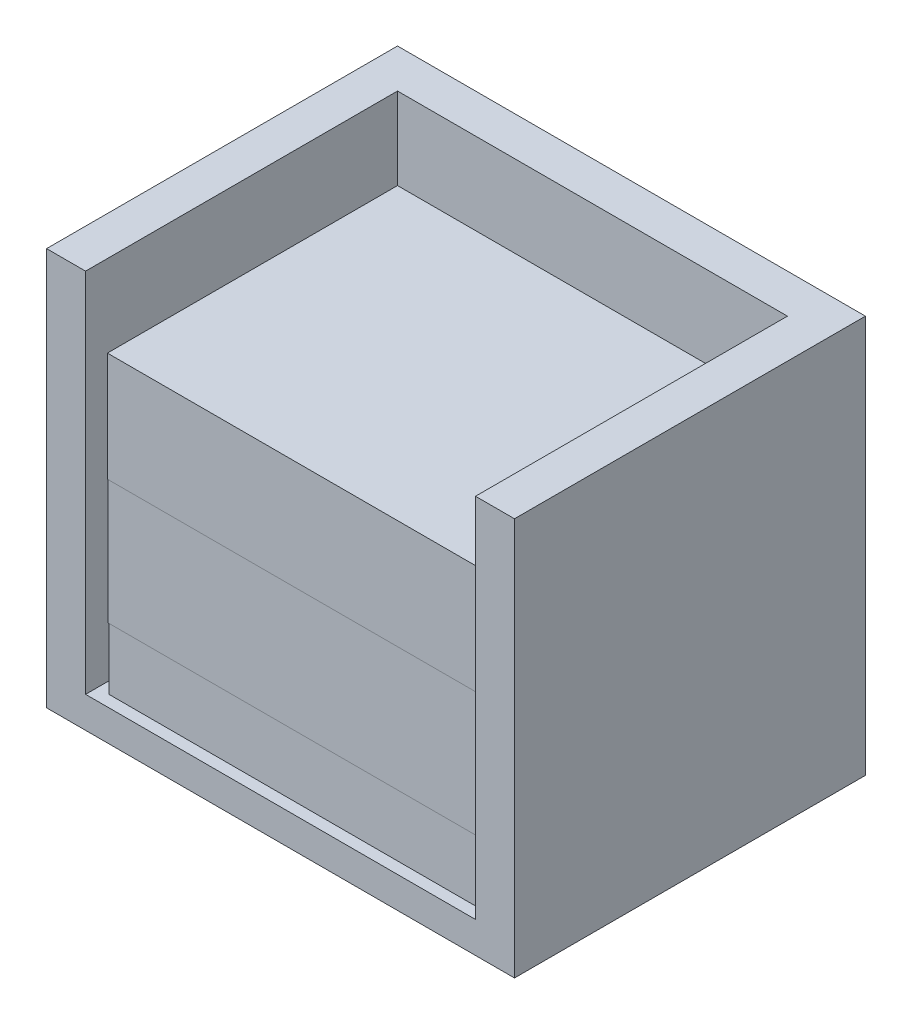
ISO-10303-21;
HEADER;
FILE_DESCRIPTION(('STEP AP214'),'2;1');
FILE_NAME('part.step','',(''),(''),'','','');
FILE_SCHEMA(('AUTOMOTIVE_DESIGN { 1 0 10303 214 1 1 1 1 }'));
ENDSEC;
DATA;
#1=APPLICATION_CONTEXT('core data for automotive mechanical design processes');
#2=APPLICATION_PROTOCOL_DEFINITION('international standard','automotive_design',2000,#1);
#3=PRODUCT_CONTEXT('',#1,'mechanical');
#4=PRODUCT('Part','Part','',(#3));
#5=PRODUCT_RELATED_PRODUCT_CATEGORY('part','',(#4));
#6=PRODUCT_DEFINITION_FORMATION('','',#4);
#7=PRODUCT_DEFINITION_CONTEXT('part definition',#1,'design');
#8=PRODUCT_DEFINITION('design','',#6,#7);
#9=PRODUCT_DEFINITION_SHAPE('','',#8);
#10=(LENGTH_UNIT() NAMED_UNIT(*) SI_UNIT(.MILLI.,.METRE.));
#11=(NAMED_UNIT(*) PLANE_ANGLE_UNIT() SI_UNIT($,.RADIAN.));
#12=(NAMED_UNIT(*) SI_UNIT($,.STERADIAN.) SOLID_ANGLE_UNIT());
#13=UNCERTAINTY_MEASURE_WITH_UNIT(LENGTH_MEASURE(1.E-05),#10,'distance_accuracy_value','');
#14=(GEOMETRIC_REPRESENTATION_CONTEXT(3) GLOBAL_UNCERTAINTY_ASSIGNED_CONTEXT((#13)) GLOBAL_UNIT_ASSIGNED_CONTEXT((#10,
#11,#12)) REPRESENTATION_CONTEXT('',''));
#15=CARTESIAN_POINT('',(0.,0.,0.));
#16=DIRECTION('',(0.,0.,1.));
#17=DIRECTION('',(1.,0.,0.));
#18=AXIS2_PLACEMENT_3D('',#15,#16,#17);
#19=CARTESIAN_POINT('',(0.,510.,215.482233502538));
#20=DIRECTION('',(0.,0.,-1.));
#21=DIRECTION('',(-1.,0.,0.));
#22=AXIS2_PLACEMENT_3D('',#19,#20,#21);
#23=PLANE('',#22);
#24=DIRECTION('',(0.,1.,0.));
#25=VECTOR('',#24,1.);
#26=CARTESIAN_POINT('',(251.522842639594,40.0000000000003,215.482233502538));
#27=LINE('',#26,#25);
#28=CARTESIAN_POINT('',(251.522842639594,40.0000000000003,215.482233502538));
#29=VERTEX_POINT('',#28);
#30=CARTESIAN_POINT('',(251.522842639594,510.,215.482233502538));
#31=VERTEX_POINT('',#30);
#32=EDGE_CURVE('E259',#29,#31,#27,.T.);
#33=ORIENTED_EDGE('',*,*,#32,.F.);
#34=DIRECTION('',(1.,0.,0.));
#35=VECTOR('',#34,1.);
#36=CARTESIAN_POINT('',(0.,40.0000000000003,215.482233502538));
#37=LINE('',#36,#35);
#38=CARTESIAN_POINT('',(-248.477157360406,40.0000000000003,215.482233502538));
#39=VERTEX_POINT('',#38);
#40=EDGE_CURVE('E245',#39,#29,#37,.T.);
#41=ORIENTED_EDGE('',*,*,#40,.F.);
#42=DIRECTION('',(0.,1.,0.));
#43=VECTOR('',#42,1.);
#44=CARTESIAN_POINT('',(-248.477157360406,40.0000000000003,215.482233502538));
#45=LINE('',#44,#43);
#46=CARTESIAN_POINT('',(-248.477157360406,510.,215.482233502538));
#47=VERTEX_POINT('',#46);
#48=EDGE_CURVE('E261',#39,#47,#45,.T.);
#49=ORIENTED_EDGE('',*,*,#48,.T.);
#50=DIRECTION('',(1.,0.,0.));
#51=VECTOR('',#50,1.);
#52=CARTESIAN_POINT('',(0.,510.,215.482233502538));
#53=LINE('',#52,#51);
#54=CARTESIAN_POINT('',(-298.477157360406,510.,215.482233502538));
#55=VERTEX_POINT('',#54);
#56=EDGE_CURVE('E270',#55,#47,#53,.T.);
#57=ORIENTED_EDGE('',*,*,#56,.F.);
#58=DIRECTION('',(0.,-1.,0.));
#59=VECTOR('',#58,1.);
#60=CARTESIAN_POINT('',(-298.477157360406,510.,215.482233502538));
#61=LINE('',#60,#59);
#62=CARTESIAN_POINT('',(-298.477157360406,0.,215.482233502538));
#63=VERTEX_POINT('',#62);
#64=EDGE_CURVE('E11',#55,#63,#61,.T.);
#65=ORIENTED_EDGE('',*,*,#64,.T.);
#66=DIRECTION('',(1.,0.,0.));
#67=VECTOR('',#66,1.);
#68=CARTESIAN_POINT('',(0.,0.,215.482233502538));
#69=LINE('',#68,#67);
#70=CARTESIAN_POINT('',(301.522842639594,0.,215.482233502538));
#71=VERTEX_POINT('',#70);
#72=EDGE_CURVE('E282',#63,#71,#69,.T.);
#73=ORIENTED_EDGE('',*,*,#72,.T.);
#74=DIRECTION('',(0.,-1.,0.));
#75=VECTOR('',#74,1.);
#76=CARTESIAN_POINT('',(301.522842639594,510.,215.482233502538));
#77=LINE('',#76,#75);
#78=CARTESIAN_POINT('',(301.522842639594,510.,215.482233502538));
#79=VERTEX_POINT('',#78);
#80=EDGE_CURVE('E42',#79,#71,#77,.T.);
#81=ORIENTED_EDGE('',*,*,#80,.F.);
#82=EDGE_CURVE('E268',#31,#79,#53,.T.);
#83=ORIENTED_EDGE('',*,*,#82,.F.);
#84=EDGE_LOOP('',(#33,#41,#49,#57,#65,#73,#81,#83));
#85=FACE_BOUND('',#84,.T.);
#86=ADVANCED_FACE('F34',(#85),#23,.F.);
#87=CARTESIAN_POINT('',(0.,510.,0.));
#88=DIRECTION('',(0.,1.,0.));
#89=DIRECTION('',(0.,0.,1.));
#90=AXIS2_PLACEMENT_3D('',#87,#88,#89);
#91=PLANE('',#90);
#92=DIRECTION('',(1.,0.,0.));
#93=VECTOR('',#92,1.);
#94=CARTESIAN_POINT('',(0.,510.,-184.517766497462));
#95=LINE('',#94,#93);
#96=CARTESIAN_POINT('',(-248.477157360406,510.,-184.517766497462));
#97=VERTEX_POINT('',#96);
#98=CARTESIAN_POINT('',(251.522842639594,510.,-184.517766497462));
#99=VERTEX_POINT('',#98);
#100=EDGE_CURVE('E57',#97,#99,#95,.T.);
#101=ORIENTED_EDGE('',*,*,#100,.T.);
#102=DIRECTION('',(0.,0.,1.));
#103=VECTOR('',#102,1.);
#104=CARTESIAN_POINT('',(251.522842639594,510.,0.));
#105=LINE('',#104,#103);
#106=EDGE_CURVE('E242',#99,#31,#105,.T.);
#107=ORIENTED_EDGE('',*,*,#106,.T.);
#108=ORIENTED_EDGE('',*,*,#82,.T.);
#109=DIRECTION('',(0.,0.,1.));
#110=VECTOR('',#109,1.);
#111=CARTESIAN_POINT('',(301.522842639594,510.,0.));
#112=LINE('',#111,#110);
#113=CARTESIAN_POINT('',(301.522842639594,510.,-234.517766497462));
#114=VERTEX_POINT('',#113);
#115=EDGE_CURVE('E273',#114,#79,#112,.T.);
#116=ORIENTED_EDGE('',*,*,#115,.F.);
#117=DIRECTION('',(1.,0.,0.));
#118=VECTOR('',#117,1.);
#119=CARTESIAN_POINT('',(0.,510.,-234.517766497462));
#120=LINE('',#119,#118);
#121=CARTESIAN_POINT('',(-298.477157360406,510.,-234.517766497462));
#122=VERTEX_POINT('',#121);
#123=EDGE_CURVE('E276',#122,#114,#120,.T.);
#124=ORIENTED_EDGE('',*,*,#123,.F.);
#125=DIRECTION('',(0.,0.,1.));
#126=VECTOR('',#125,1.);
#127=CARTESIAN_POINT('',(-298.477157360406,510.,0.));
#128=LINE('',#127,#126);
#129=EDGE_CURVE('E265',#122,#55,#128,.T.);
#130=ORIENTED_EDGE('',*,*,#129,.T.);
#131=ORIENTED_EDGE('',*,*,#56,.T.);
#132=DIRECTION('',(0.,0.,1.));
#133=VECTOR('',#132,1.);
#134=CARTESIAN_POINT('',(-248.477157360406,510.,0.));
#135=LINE('',#134,#133);
#136=EDGE_CURVE('E252',#97,#47,#135,.T.);
#137=ORIENTED_EDGE('',*,*,#136,.F.);
#138=EDGE_LOOP('',(#101,#107,#108,#116,#124,#130,#131,#137));
#139=FACE_BOUND('',#138,.T.);
#140=ADVANCED_FACE('F310',(#139),#91,.T.);
#141=CARTESIAN_POINT('',(-298.477157360406,510.,0.));
#142=DIRECTION('',(1.,0.,0.));
#143=DIRECTION('',(0.,0.,-1.));
#144=AXIS2_PLACEMENT_3D('',#141,#142,#143);
#145=PLANE('',#144);
#146=DIRECTION('',(0.,0.,1.));
#147=VECTOR('',#146,1.);
#148=CARTESIAN_POINT('',(-298.477157360406,0.,0.));
#149=LINE('',#148,#147);
#150=CARTESIAN_POINT('',(-298.477157360406,0.,-234.517766497462));
#151=VERTEX_POINT('',#150);
#152=EDGE_CURVE('E258',#151,#63,#149,.T.);
#153=ORIENTED_EDGE('',*,*,#152,.T.);
#154=ORIENTED_EDGE('',*,*,#64,.F.);
#155=ORIENTED_EDGE('',*,*,#129,.F.);
#156=DIRECTION('',(0.,-1.,0.));
#157=VECTOR('',#156,1.);
#158=CARTESIAN_POINT('',(-298.477157360406,510.,-234.517766497462));
#159=LINE('',#158,#157);
#160=EDGE_CURVE('E279',#122,#151,#159,.T.);
#161=ORIENTED_EDGE('',*,*,#160,.T.);
#162=EDGE_LOOP('',(#153,#154,#155,#161));
#163=FACE_BOUND('',#162,.T.);
#164=ADVANCED_FACE('F36',(#163),#145,.F.);
#165=CARTESIAN_POINT('',(301.522842639594,510.,0.));
#166=DIRECTION('',(1.,0.,0.));
#167=DIRECTION('',(0.,0.,-1.));
#168=AXIS2_PLACEMENT_3D('',#165,#166,#167);
#169=PLANE('',#168);
#170=DIRECTION('',(0.,0.,1.));
#171=VECTOR('',#170,1.);
#172=CARTESIAN_POINT('',(301.522842639594,0.,0.));
#173=LINE('',#172,#171);
#174=CARTESIAN_POINT('',(301.522842639594,0.,-234.517766497462));
#175=VERTEX_POINT('',#174);
#176=EDGE_CURVE('E285',#175,#71,#173,.T.);
#177=ORIENTED_EDGE('',*,*,#176,.F.);
#178=DIRECTION('',(0.,-1.,0.));
#179=VECTOR('',#178,1.);
#180=CARTESIAN_POINT('',(301.522842639594,510.,-234.517766497462));
#181=LINE('',#180,#179);
#182=EDGE_CURVE('E291',#114,#175,#181,.T.);
#183=ORIENTED_EDGE('',*,*,#182,.F.);
#184=ORIENTED_EDGE('',*,*,#115,.T.);
#185=ORIENTED_EDGE('',*,*,#80,.T.);
#186=EDGE_LOOP('',(#177,#183,#184,#185));
#187=FACE_BOUND('',#186,.T.);
#188=ADVANCED_FACE('F295',(#187),#169,.T.);
#189=CARTESIAN_POINT('',(0.,510.,-234.517766497462));
#190=DIRECTION('',(0.,0.,-1.));
#191=DIRECTION('',(-1.,0.,0.));
#192=AXIS2_PLACEMENT_3D('',#189,#190,#191);
#193=PLANE('',#192);
#194=DIRECTION('',(1.,0.,0.));
#195=VECTOR('',#194,1.);
#196=CARTESIAN_POINT('',(0.,0.,-234.517766497462));
#197=LINE('',#196,#195);
#198=EDGE_CURVE('E269',#151,#175,#197,.T.);
#199=ORIENTED_EDGE('',*,*,#198,.F.);
#200=ORIENTED_EDGE('',*,*,#160,.F.);
#201=ORIENTED_EDGE('',*,*,#123,.T.);
#202=ORIENTED_EDGE('',*,*,#182,.T.);
#203=EDGE_LOOP('',(#199,#200,#201,#202));
#204=FACE_BOUND('',#203,.T.);
#205=ADVANCED_FACE('F306',(#204),#193,.T.);
#206=CARTESIAN_POINT('',(0.,0.,0.));
#207=DIRECTION('',(0.,1.,0.));
#208=DIRECTION('',(0.,0.,1.));
#209=AXIS2_PLACEMENT_3D('',#206,#207,#208);
#210=PLANE('',#209);
#211=CARTESIAN_POINT('',(0.,0.,0.));
#212=DIRECTION('',(0.,-1.,0.));
#213=DIRECTION('',(0.,0.,-1.));
#214=AXIS2_PLACEMENT_3D('',#211,#212,#213);
#215=CIRCLE('',#214,150.);
#216=CARTESIAN_POINT('',(0.,0.,-150.));
#217=VERTEX_POINT('',#216);
#218=EDGE_CURVE('E398',#217,#217,#215,.T.);
#219=ORIENTED_EDGE('',*,*,#218,.F.);
#220=EDGE_LOOP('',(#219));
#221=FACE_BOUND('',#220,.T.);
#222=ORIENTED_EDGE('',*,*,#152,.F.);
#223=ORIENTED_EDGE('',*,*,#198,.T.);
#224=ORIENTED_EDGE('',*,*,#176,.T.);
#225=ORIENTED_EDGE('',*,*,#72,.F.);
#226=EDGE_LOOP('',(#222,#223,#224,#225));
#227=FACE_BOUND('',#226,.T.);
#228=ADVANCED_FACE('F303',(#221,#227),#210,.F.);
#229=CARTESIAN_POINT('',(0.,40.0000000000003,-184.517766497462));
#230=DIRECTION('',(0.,0.,1.));
#231=DIRECTION('',(1.,0.,0.));
#232=AXIS2_PLACEMENT_3D('',#229,#230,#231);
#233=PLANE('',#232);
#234=ORIENTED_EDGE('',*,*,#100,.F.);
#235=DIRECTION('',(0.,1.,0.));
#236=VECTOR('',#235,1.);
#237=CARTESIAN_POINT('',(-248.477157360406,40.0000000000003,-184.517766497462));
#238=LINE('',#237,#236);
#239=CARTESIAN_POINT('',(-248.477157360406,40.0000000000003,-184.517766497462));
#240=VERTEX_POINT('',#239);
#241=EDGE_CURVE('E250',#240,#97,#238,.T.);
#242=ORIENTED_EDGE('',*,*,#241,.F.);
#243=DIRECTION('',(1.,0.,0.));
#244=VECTOR('',#243,1.);
#245=CARTESIAN_POINT('',(0.,40.0000000000003,-184.517766497462));
#246=LINE('',#245,#244);
#247=CARTESIAN_POINT('',(251.522842639594,40.0000000000003,-184.517766497462));
#248=VERTEX_POINT('',#247);
#249=EDGE_CURVE('E238',#240,#248,#246,.T.);
#250=ORIENTED_EDGE('',*,*,#249,.T.);
#251=DIRECTION('',(0.,1.,0.));
#252=VECTOR('',#251,1.);
#253=CARTESIAN_POINT('',(251.522842639594,40.0000000000003,-184.517766497462));
#254=LINE('',#253,#252);
#255=EDGE_CURVE('E256',#248,#99,#254,.T.);
#256=ORIENTED_EDGE('',*,*,#255,.T.);
#257=EDGE_LOOP('',(#234,#242,#250,#256));
#258=FACE_BOUND('',#257,.T.);
#259=ADVANCED_FACE('F337',(#258),#233,.T.);
#260=CARTESIAN_POINT('',(251.522842639594,40.0000000000003,0.));
#261=DIRECTION('',(-1.,0.,0.));
#262=DIRECTION('',(0.,0.,1.));
#263=AXIS2_PLACEMENT_3D('',#260,#261,#262);
#264=PLANE('',#263);
#265=ORIENTED_EDGE('',*,*,#106,.F.);
#266=ORIENTED_EDGE('',*,*,#255,.F.);
#267=DIRECTION('',(0.,0.,1.));
#268=VECTOR('',#267,1.);
#269=CARTESIAN_POINT('',(251.522842639594,40.0000000000003,0.));
#270=LINE('',#269,#268);
#271=EDGE_CURVE('E248',#248,#29,#270,.T.);
#272=ORIENTED_EDGE('',*,*,#271,.T.);
#273=ORIENTED_EDGE('',*,*,#32,.T.);
#274=EDGE_LOOP('',(#265,#266,#272,#273));
#275=FACE_BOUND('',#274,.T.);
#276=ADVANCED_FACE('F313',(#275),#264,.T.);
#277=CARTESIAN_POINT('',(-248.477157360406,40.0000000000003,0.));
#278=DIRECTION('',(-1.,0.,0.));
#279=DIRECTION('',(0.,0.,1.));
#280=AXIS2_PLACEMENT_3D('',#277,#278,#279);
#281=PLANE('',#280);
#282=ORIENTED_EDGE('',*,*,#136,.T.);
#283=ORIENTED_EDGE('',*,*,#48,.F.);
#284=DIRECTION('',(0.,0.,1.));
#285=VECTOR('',#284,1.);
#286=CARTESIAN_POINT('',(-248.477157360406,40.0000000000003,0.));
#287=LINE('',#286,#285);
#288=EDGE_CURVE('E241',#240,#39,#287,.T.);
#289=ORIENTED_EDGE('',*,*,#288,.F.);
#290=ORIENTED_EDGE('',*,*,#241,.T.);
#291=EDGE_LOOP('',(#282,#283,#289,#290));
#292=FACE_BOUND('',#291,.T.);
#293=ADVANCED_FACE('F320',(#292),#281,.F.);
#294=CARTESIAN_POINT('',(0.,40.0000000000003,0.));
#295=DIRECTION('',(0.,1.,0.));
#296=DIRECTION('',(0.,0.,1.));
#297=AXIS2_PLACEMENT_3D('',#294,#295,#296);
#298=PLANE('',#297);
#299=DIRECTION('',(0.,0.,-1.));
#300=VECTOR('',#299,1.);
#301=CARTESIAN_POINT('',(-233.477157360406,40.0000000000003,0.));
#302=LINE('',#301,#300);
#303=CARTESIAN_POINT('',(-233.477157360406,40.0000000000003,200.482233502538));
#304=VERTEX_POINT('',#303);
#305=CARTESIAN_POINT('',(-233.477157360406,40.0000000000003,-169.517766497462));
#306=VERTEX_POINT('',#305);
#307=EDGE_CURVE('E215',#304,#306,#302,.T.);
#308=ORIENTED_EDGE('',*,*,#307,.T.);
#309=DIRECTION('',(-1.,0.,0.));
#310=VECTOR('',#309,1.);
#311=CARTESIAN_POINT('',(0.,40.0000000000003,-169.517766497462));
#312=LINE('',#311,#310);
#313=CARTESIAN_POINT('',(236.522842639594,40.0000000000003,-169.517766497462));
#314=VERTEX_POINT('',#313);
#315=EDGE_CURVE('E220',#314,#306,#312,.T.);
#316=ORIENTED_EDGE('',*,*,#315,.F.);
#317=DIRECTION('',(0.,0.,-1.));
#318=VECTOR('',#317,1.);
#319=CARTESIAN_POINT('',(236.522842639594,40.0000000000003,0.));
#320=LINE('',#319,#318);
#321=CARTESIAN_POINT('',(236.522842639594,40.0000000000003,200.482233502538));
#322=VERTEX_POINT('',#321);
#323=EDGE_CURVE('E228',#322,#314,#320,.T.);
#324=ORIENTED_EDGE('',*,*,#323,.F.);
#325=DIRECTION('',(1.,0.,0.));
#326=VECTOR('',#325,1.);
#327=CARTESIAN_POINT('',(0.,40.0000000000003,200.482233502538));
#328=LINE('',#327,#326);
#329=EDGE_CURVE('E226',#304,#322,#328,.T.);
#330=ORIENTED_EDGE('',*,*,#329,.F.);
#331=EDGE_LOOP('',(#308,#316,#324,#330));
#332=FACE_BOUND('',#331,.T.);
#333=ORIENTED_EDGE('',*,*,#249,.F.);
#334=ORIENTED_EDGE('',*,*,#288,.T.);
#335=ORIENTED_EDGE('',*,*,#40,.T.);
#336=ORIENTED_EDGE('',*,*,#271,.F.);
#337=EDGE_LOOP('',(#333,#334,#335,#336));
#338=FACE_BOUND('',#337,.T.);
#339=ADVANCED_FACE('F317',(#332,#338),#298,.T.);
#340=CARTESIAN_POINT('',(-233.477157360406,120.,0.));
#341=DIRECTION('',(-1.,0.,0.));
#342=DIRECTION('',(0.,0.,1.));
#343=AXIS2_PLACEMENT_3D('',#340,#341,#342);
#344=PLANE('',#343);
#345=ORIENTED_EDGE('',*,*,#307,.F.);
#346=DIRECTION('',(0.,-1.,0.));
#347=VECTOR('',#346,1.);
#348=CARTESIAN_POINT('',(-233.477157360406,120.,200.482233502538));
#349=LINE('',#348,#347);
#350=CARTESIAN_POINT('',(-233.477157360406,120.,200.482233502538));
#351=VERTEX_POINT('',#350);
#352=EDGE_CURVE('E236',#351,#304,#349,.T.);
#353=ORIENTED_EDGE('',*,*,#352,.F.);
#354=DIRECTION('',(0.,0.,1.));
#355=VECTOR('',#354,1.);
#356=CARTESIAN_POINT('',(-233.477157360406,120.,-169.517766497462));
#357=LINE('',#356,#355);
#358=CARTESIAN_POINT('',(-233.477157360406,120.,201.671334822372));
#359=VERTEX_POINT('',#358);
#360=EDGE_CURVE('E187',#351,#359,#357,.T.);
#361=ORIENTED_EDGE('',*,*,#360,.T.);
#362=DIRECTION('',(0.,-1.,0.));
#363=VECTOR('',#362,1.);
#364=CARTESIAN_POINT('',(-233.477157360406,280.,201.671334822372));
#365=LINE('',#364,#363);
#366=CARTESIAN_POINT('',(-233.477157360406,280.,201.671334822372));
#367=VERTEX_POINT('',#366);
#368=EDGE_CURVE('E212',#367,#359,#365,.T.);
#369=ORIENTED_EDGE('',*,*,#368,.F.);
#370=DIRECTION('',(0.,0.,1.));
#371=VECTOR('',#370,1.);
#372=CARTESIAN_POINT('',(-233.477157360406,280.,-169.517766497462));
#373=LINE('',#372,#371);
#374=CARTESIAN_POINT('',(-233.477157360406,280.,202.521800626828));
#375=VERTEX_POINT('',#374);
#376=EDGE_CURVE('E185',#367,#375,#373,.T.);
#377=ORIENTED_EDGE('',*,*,#376,.T.);
#378=DIRECTION('',(0.,-1.,0.));
#379=VECTOR('',#378,1.);
#380=CARTESIAN_POINT('',(-233.477157360406,420.,202.521800626828));
#381=LINE('',#380,#379);
#382=CARTESIAN_POINT('',(-233.477157360406,420.,202.521800626828));
#383=VERTEX_POINT('',#382);
#384=EDGE_CURVE('E165',#383,#375,#381,.T.);
#385=ORIENTED_EDGE('',*,*,#384,.F.);
#386=DIRECTION('',(0.,0.,1.));
#387=VECTOR('',#386,1.);
#388=CARTESIAN_POINT('',(-233.477157360406,420.,-169.517766497462));
#389=LINE('',#388,#387);
#390=CARTESIAN_POINT('',(-233.477157360406,420.,-169.517766497462));
#391=VERTEX_POINT('',#390);
#392=EDGE_CURVE('E171',#391,#383,#389,.T.);
#393=ORIENTED_EDGE('',*,*,#392,.F.);
#394=DIRECTION('',(0.,-1.,0.));
#395=VECTOR('',#394,1.);
#396=CARTESIAN_POINT('',(-233.477157360406,120.,-169.517766497462));
#397=LINE('',#396,#395);
#398=EDGE_CURVE('E223',#391,#306,#397,.T.);
#399=ORIENTED_EDGE('',*,*,#398,.T.);
#400=EDGE_LOOP('',(#345,#353,#361,#369,#377,#385,#393,#399));
#401=FACE_BOUND('',#400,.T.);
#402=ADVANCED_FACE('F182',(#401),#344,.T.);
#403=CARTESIAN_POINT('',(0.,120.,200.482233502538));
#404=DIRECTION('',(0.,0.,-1.));
#405=DIRECTION('',(-1.,0.,0.));
#406=AXIS2_PLACEMENT_3D('',#403,#404,#405);
#407=PLANE('',#406);
#408=ORIENTED_EDGE('',*,*,#329,.T.);
#409=DIRECTION('',(0.,-1.,0.));
#410=VECTOR('',#409,1.);
#411=CARTESIAN_POINT('',(236.522842639594,120.,200.482233502538));
#412=LINE('',#411,#410);
#413=CARTESIAN_POINT('',(236.522842639594,120.,200.482233502538));
#414=VERTEX_POINT('',#413);
#415=EDGE_CURVE('E233',#414,#322,#412,.T.);
#416=ORIENTED_EDGE('',*,*,#415,.F.);
#417=DIRECTION('',(1.,0.,0.));
#418=VECTOR('',#417,1.);
#419=CARTESIAN_POINT('',(0.,120.,200.482233502538));
#420=LINE('',#419,#418);
#421=EDGE_CURVE('E216',#351,#414,#420,.T.);
#422=ORIENTED_EDGE('',*,*,#421,.F.);
#423=ORIENTED_EDGE('',*,*,#352,.T.);
#424=EDGE_LOOP('',(#408,#416,#422,#423));
#425=FACE_BOUND('',#424,.T.);
#426=ADVANCED_FACE('F351',(#425),#407,.F.);
#427=CARTESIAN_POINT('',(236.522842639594,120.,0.));
#428=DIRECTION('',(-1.,0.,0.));
#429=DIRECTION('',(0.,0.,1.));
#430=AXIS2_PLACEMENT_3D('',#427,#428,#429);
#431=PLANE('',#430);
#432=ORIENTED_EDGE('',*,*,#323,.T.);
#433=DIRECTION('',(0.,-1.,0.));
#434=VECTOR('',#433,1.);
#435=CARTESIAN_POINT('',(236.522842639594,120.,-169.517766497462));
#436=LINE('',#435,#434);
#437=CARTESIAN_POINT('',(236.522842639594,120.,-169.517766497462));
#438=VERTEX_POINT('',#437);
#439=EDGE_CURVE('E49',#438,#314,#436,.T.);
#440=ORIENTED_EDGE('',*,*,#439,.F.);
#441=DIRECTION('',(0.,0.,-1.));
#442=VECTOR('',#441,1.);
#443=CARTESIAN_POINT('',(236.522842639594,120.,0.));
#444=LINE('',#443,#442);
#445=EDGE_CURVE('E219',#414,#438,#444,.T.);
#446=ORIENTED_EDGE('',*,*,#445,.F.);
#447=ORIENTED_EDGE('',*,*,#415,.T.);
#448=EDGE_LOOP('',(#432,#440,#446,#447));
#449=FACE_BOUND('',#448,.T.);
#450=ADVANCED_FACE('F354',(#449),#431,.F.);
#451=CARTESIAN_POINT('',(0.,120.,-169.517766497462));
#452=DIRECTION('',(0.,0.,1.));
#453=DIRECTION('',(1.,0.,0.));
#454=AXIS2_PLACEMENT_3D('',#451,#452,#453);
#455=PLANE('',#454);
#456=ORIENTED_EDGE('',*,*,#315,.T.);
#457=ORIENTED_EDGE('',*,*,#398,.F.);
#458=DIRECTION('',(-1.,0.,0.));
#459=VECTOR('',#458,1.);
#460=CARTESIAN_POINT('',(-233.477157360406,420.,-169.517766497462));
#461=LINE('',#460,#459);
#462=CARTESIAN_POINT('',(239.176081011443,420.,-169.517766497462));
#463=VERTEX_POINT('',#462);
#464=EDGE_CURVE('E177',#463,#391,#461,.T.);
#465=ORIENTED_EDGE('',*,*,#464,.F.);
#466=DIRECTION('',(0.,-1.,0.));
#467=VECTOR('',#466,1.);
#468=CARTESIAN_POINT('',(239.176081011443,420.,-169.517766497462));
#469=LINE('',#468,#467);
#470=CARTESIAN_POINT('',(239.176081011443,280.,-169.517766497462));
#471=VERTEX_POINT('',#470);
#472=EDGE_CURVE('E191',#463,#471,#469,.T.);
#473=ORIENTED_EDGE('',*,*,#472,.T.);
#474=DIRECTION('',(-1.,0.,0.));
#475=VECTOR('',#474,1.);
#476=CARTESIAN_POINT('',(-233.477157360406,280.,-169.517766497462));
#477=LINE('',#476,#475);
#478=CARTESIAN_POINT('',(237.482092311038,280.,-169.517766497462));
#479=VERTEX_POINT('',#478);
#480=EDGE_CURVE('E179',#471,#479,#477,.T.);
#481=ORIENTED_EDGE('',*,*,#480,.T.);
#482=DIRECTION('',(0.,-1.,0.));
#483=VECTOR('',#482,1.);
#484=CARTESIAN_POINT('',(237.482092311038,280.,-169.517766497462));
#485=LINE('',#484,#483);
#486=CARTESIAN_POINT('',(237.482092311038,120.,-169.517766497462));
#487=VERTEX_POINT('',#486);
#488=EDGE_CURVE('E201',#479,#487,#485,.T.);
#489=ORIENTED_EDGE('',*,*,#488,.T.);
#490=DIRECTION('',(-1.,0.,0.));
#491=VECTOR('',#490,1.);
#492=CARTESIAN_POINT('',(-233.477157360406,120.,-169.517766497462));
#493=LINE('',#492,#491);
#494=EDGE_CURVE('E199',#487,#438,#493,.T.);
#495=ORIENTED_EDGE('',*,*,#494,.T.);
#496=ORIENTED_EDGE('',*,*,#439,.T.);
#497=EDGE_LOOP('',(#456,#457,#465,#473,#481,#489,#495,#496));
#498=FACE_BOUND('',#497,.T.);
#499=ADVANCED_FACE('F358',(#498),#455,.F.);
#500=CARTESIAN_POINT('',(0.,120.,0.));
#501=DIRECTION('',(0.,1.,0.));
#502=DIRECTION('',(0.,0.,1.));
#503=AXIS2_PLACEMENT_3D('',#500,#501,#502);
#504=PLANE('',#503);
#505=ORIENTED_EDGE('',*,*,#360,.F.);
#506=ORIENTED_EDGE('',*,*,#421,.T.);
#507=ORIENTED_EDGE('',*,*,#445,.T.);
#508=ORIENTED_EDGE('',*,*,#494,.F.);
#509=DIRECTION('',(0.,0.,-1.));
#510=VECTOR('',#509,1.);
#511=CARTESIAN_POINT('',(237.482092311038,120.,-169.517766497462));
#512=LINE('',#511,#510);
#513=CARTESIAN_POINT('',(237.482092311038,120.,201.671334822372));
#514=VERTEX_POINT('',#513);
#515=EDGE_CURVE('E204',#514,#487,#512,.T.);
#516=ORIENTED_EDGE('',*,*,#515,.F.);
#517=DIRECTION('',(1.,0.,0.));
#518=VECTOR('',#517,1.);
#519=CARTESIAN_POINT('',(-233.477157360406,120.,201.671334822372));
#520=LINE('',#519,#518);
#521=EDGE_CURVE('E189',#359,#514,#520,.T.);
#522=ORIENTED_EDGE('',*,*,#521,.F.);
#523=EDGE_LOOP('',(#505,#506,#507,#508,#516,#522));
#524=FACE_BOUND('',#523,.T.);
#525=ADVANCED_FACE('F362',(#524),#504,.F.);
#526=CARTESIAN_POINT('',(-233.477157360406,280.,201.671334822372));
#527=DIRECTION('',(0.,0.,-1.));
#528=DIRECTION('',(-1.,0.,0.));
#529=AXIS2_PLACEMENT_3D('',#526,#527,#528);
#530=PLANE('',#529);
#531=ORIENTED_EDGE('',*,*,#521,.T.);
#532=DIRECTION('',(0.,-1.,0.));
#533=VECTOR('',#532,1.);
#534=CARTESIAN_POINT('',(237.482092311038,280.,201.671334822372));
#535=LINE('',#534,#533);
#536=CARTESIAN_POINT('',(237.482092311038,280.,201.671334822372));
#537=VERTEX_POINT('',#536);
#538=EDGE_CURVE('E209',#537,#514,#535,.T.);
#539=ORIENTED_EDGE('',*,*,#538,.F.);
#540=DIRECTION('',(1.,0.,0.));
#541=VECTOR('',#540,1.);
#542=CARTESIAN_POINT('',(-233.477157360406,280.,201.671334822372));
#543=LINE('',#542,#541);
#544=EDGE_CURVE('E195',#367,#537,#543,.T.);
#545=ORIENTED_EDGE('',*,*,#544,.F.);
#546=ORIENTED_EDGE('',*,*,#368,.T.);
#547=EDGE_LOOP('',(#531,#539,#545,#546));
#548=FACE_BOUND('',#547,.T.);
#549=ADVANCED_FACE('F363',(#548),#530,.F.);
#550=CARTESIAN_POINT('',(237.482092311038,280.,-169.517766497462));
#551=DIRECTION('',(-1.,0.,0.));
#552=DIRECTION('',(0.,0.,1.));
#553=AXIS2_PLACEMENT_3D('',#550,#551,#552);
#554=PLANE('',#553);
#555=ORIENTED_EDGE('',*,*,#515,.T.);
#556=ORIENTED_EDGE('',*,*,#488,.F.);
#557=DIRECTION('',(0.,0.,-1.));
#558=VECTOR('',#557,1.);
#559=CARTESIAN_POINT('',(237.482092311038,280.,-169.517766497462));
#560=LINE('',#559,#558);
#561=EDGE_CURVE('E198',#537,#479,#560,.T.);
#562=ORIENTED_EDGE('',*,*,#561,.F.);
#563=ORIENTED_EDGE('',*,*,#538,.T.);
#564=EDGE_LOOP('',(#555,#556,#562,#563));
#565=FACE_BOUND('',#564,.T.);
#566=ADVANCED_FACE('F366',(#565),#554,.F.);
#567=CARTESIAN_POINT('',(0.,280.,0.));
#568=DIRECTION('',(0.,1.,0.));
#569=DIRECTION('',(0.,0.,1.));
#570=AXIS2_PLACEMENT_3D('',#567,#568,#569);
#571=PLANE('',#570);
#572=ORIENTED_EDGE('',*,*,#376,.F.);
#573=ORIENTED_EDGE('',*,*,#544,.T.);
#574=ORIENTED_EDGE('',*,*,#561,.T.);
#575=ORIENTED_EDGE('',*,*,#480,.F.);
#576=DIRECTION('',(0.,0.,-1.));
#577=VECTOR('',#576,1.);
#578=CARTESIAN_POINT('',(239.176081011443,280.,-169.517766497462));
#579=LINE('',#578,#577);
#580=CARTESIAN_POINT('',(239.176081011443,280.,202.521800626828));
#581=VERTEX_POINT('',#580);
#582=EDGE_CURVE('E408',#581,#471,#579,.T.);
#583=ORIENTED_EDGE('',*,*,#582,.F.);
#584=DIRECTION('',(1.,0.,0.));
#585=VECTOR('',#584,1.);
#586=CARTESIAN_POINT('',(-233.477157360406,280.,202.521800626828));
#587=LINE('',#586,#585);
#588=EDGE_CURVE('E400',#375,#581,#587,.T.);
#589=ORIENTED_EDGE('',*,*,#588,.F.);
#590=EDGE_LOOP('',(#572,#573,#574,#575,#583,#589));
#591=FACE_BOUND('',#590,.T.);
#592=ADVANCED_FACE('F370',(#591),#571,.F.);
#593=CARTESIAN_POINT('',(-233.477157360406,420.,202.521800626828));
#594=DIRECTION('',(0.,0.,-1.));
#595=DIRECTION('',(-1.,0.,0.));
#596=AXIS2_PLACEMENT_3D('',#593,#594,#595);
#597=PLANE('',#596);
#598=ORIENTED_EDGE('',*,*,#588,.T.);
#599=DIRECTION('',(0.,-1.,0.));
#600=VECTOR('',#599,1.);
#601=CARTESIAN_POINT('',(239.176081011443,420.,202.521800626828));
#602=LINE('',#601,#600);
#603=CARTESIAN_POINT('',(239.176081011443,420.,202.521800626828));
#604=VERTEX_POINT('',#603);
#605=EDGE_CURVE('E167',#604,#581,#602,.T.);
#606=ORIENTED_EDGE('',*,*,#605,.F.);
#607=DIRECTION('',(1.,0.,0.));
#608=VECTOR('',#607,1.);
#609=CARTESIAN_POINT('',(-233.477157360406,420.,202.521800626828));
#610=LINE('',#609,#608);
#611=EDGE_CURVE('E161',#383,#604,#610,.T.);
#612=ORIENTED_EDGE('',*,*,#611,.F.);
#613=ORIENTED_EDGE('',*,*,#384,.T.);
#614=EDGE_LOOP('',(#598,#606,#612,#613));
#615=FACE_BOUND('',#614,.T.);
#616=ADVANCED_FACE('F163',(#615),#597,.F.);
#617=CARTESIAN_POINT('',(239.176081011443,420.,-169.517766497462));
#618=DIRECTION('',(-1.,0.,0.));
#619=DIRECTION('',(0.,0.,1.));
#620=AXIS2_PLACEMENT_3D('',#617,#618,#619);
#621=PLANE('',#620);
#622=ORIENTED_EDGE('',*,*,#582,.T.);
#623=ORIENTED_EDGE('',*,*,#472,.F.);
#624=DIRECTION('',(0.,0.,-1.));
#625=VECTOR('',#624,1.);
#626=CARTESIAN_POINT('',(239.176081011443,420.,-169.517766497462));
#627=LINE('',#626,#625);
#628=EDGE_CURVE('E170',#604,#463,#627,.T.);
#629=ORIENTED_EDGE('',*,*,#628,.F.);
#630=ORIENTED_EDGE('',*,*,#605,.T.);
#631=EDGE_LOOP('',(#622,#623,#629,#630));
#632=FACE_BOUND('',#631,.T.);
#633=ADVANCED_FACE('F377',(#632),#621,.F.);
#634=CARTESIAN_POINT('',(0.,420.,0.));
#635=DIRECTION('',(0.,1.,0.));
#636=DIRECTION('',(0.,0.,1.));
#637=AXIS2_PLACEMENT_3D('',#634,#635,#636);
#638=PLANE('',#637);
#639=ORIENTED_EDGE('',*,*,#392,.T.);
#640=ORIENTED_EDGE('',*,*,#611,.T.);
#641=ORIENTED_EDGE('',*,*,#628,.T.);
#642=ORIENTED_EDGE('',*,*,#464,.T.);
#643=EDGE_LOOP('',(#639,#640,#641,#642));
#644=FACE_BOUND('',#643,.T.);
#645=ADVANCED_FACE('F175',(#644),#638,.T.);
#646=CARTESIAN_POINT('',(0.,90.,0.));
#647=DIRECTION('',(0.,-1.,0.));
#648=DIRECTION('',(0.,0.,-1.));
#649=AXIS2_PLACEMENT_3D('',#646,#647,#648);
#650=CYLINDRICAL_SURFACE('',#649,150.);
#651=CARTESIAN_POINT('',(0.,90.,0.));
#652=DIRECTION('',(0.,-1.,0.));
#653=DIRECTION('',(0.,0.,-1.));
#654=AXIS2_PLACEMENT_3D('',#651,#652,#653);
#655=CIRCLE('',#654,150.);
#656=CARTESIAN_POINT('',(0.,90.,-150.));
#657=VERTEX_POINT('',#656);
#658=EDGE_CURVE('E397',#657,#657,#655,.T.);
#659=CARTESIAN_POINT('',(0.,90.,-150.));
#660=CARTESIAN_POINT('',(0.,89.0625,-150.));
#661=CARTESIAN_POINT('',(0.,88.125,-150.));
#662=CARTESIAN_POINT('',(0.,86.25,-150.));
#663=CARTESIAN_POINT('',(0.,85.3125,-150.));
#664=CARTESIAN_POINT('',(0.,83.4375,-150.));
#665=CARTESIAN_POINT('',(0.,82.5,-150.));
#666=CARTESIAN_POINT('',(0.,80.625,-150.));
#667=CARTESIAN_POINT('',(0.,79.6875,-150.));
#668=CARTESIAN_POINT('',(0.,77.8125,-150.));
#669=CARTESIAN_POINT('',(0.,76.875,-150.));
#670=CARTESIAN_POINT('',(0.,75.,-150.));
#671=CARTESIAN_POINT('',(0.,74.0625,-150.));
#672=CARTESIAN_POINT('',(0.,72.1875,-150.));
#673=CARTESIAN_POINT('',(0.,71.25,-150.));
#674=CARTESIAN_POINT('',(0.,69.375,-150.));
#675=CARTESIAN_POINT('',(0.,68.4375,-150.));
#676=CARTESIAN_POINT('',(0.,66.5625,-150.));
#677=CARTESIAN_POINT('',(0.,65.625,-150.));
#678=CARTESIAN_POINT('',(0.,63.75,-150.));
#679=CARTESIAN_POINT('',(0.,62.8125,-150.));
#680=CARTESIAN_POINT('',(0.,60.9375,-150.));
#681=CARTESIAN_POINT('',(0.,60.,-150.));
#682=CARTESIAN_POINT('',(0.,58.125,-150.));
#683=CARTESIAN_POINT('',(0.,57.1875,-150.));
#684=CARTESIAN_POINT('',(0.,55.3125,-150.));
#685=CARTESIAN_POINT('',(0.,54.375,-150.));
#686=CARTESIAN_POINT('',(0.,52.5,-150.));
#687=CARTESIAN_POINT('',(0.,51.5625,-150.));
#688=CARTESIAN_POINT('',(0.,49.6875,-150.));
#689=CARTESIAN_POINT('',(0.,48.75,-150.));
#690=CARTESIAN_POINT('',(0.,46.875,-150.));
#691=CARTESIAN_POINT('',(0.,45.9375,-150.));
#692=CARTESIAN_POINT('',(0.,44.0625,-150.));
#693=CARTESIAN_POINT('',(0.,43.125,-150.));
#694=CARTESIAN_POINT('',(0.,41.25,-150.));
#695=CARTESIAN_POINT('',(0.,40.3125,-150.));
#696=CARTESIAN_POINT('',(0.,38.4375,-150.));
#697=CARTESIAN_POINT('',(0.,37.5,-150.));
#698=CARTESIAN_POINT('',(0.,35.625,-150.));
#699=CARTESIAN_POINT('',(0.,34.6875,-150.));
#700=CARTESIAN_POINT('',(0.,32.8125,-150.));
#701=CARTESIAN_POINT('',(0.,31.875,-150.));
#702=CARTESIAN_POINT('',(0.,30.,-150.));
#703=CARTESIAN_POINT('',(0.,29.0625,-150.));
#704=CARTESIAN_POINT('',(0.,27.1875,-150.));
#705=CARTESIAN_POINT('',(0.,26.25,-150.));
#706=CARTESIAN_POINT('',(0.,24.375,-150.));
#707=CARTESIAN_POINT('',(0.,23.4375,-150.));
#708=CARTESIAN_POINT('',(0.,21.5625,-150.));
#709=CARTESIAN_POINT('',(0.,20.625,-150.));
#710=CARTESIAN_POINT('',(0.,18.75,-150.));
#711=CARTESIAN_POINT('',(0.,17.8125,-150.));
#712=CARTESIAN_POINT('',(0.,15.9375,-150.));
#713=CARTESIAN_POINT('',(0.,15.,-150.));
#714=CARTESIAN_POINT('',(0.,13.125,-150.));
#715=CARTESIAN_POINT('',(0.,12.1875,-150.));
#716=CARTESIAN_POINT('',(0.,10.3125,-150.));
#717=CARTESIAN_POINT('',(0.,9.37500000000001,-150.));
#718=CARTESIAN_POINT('',(0.,7.50000000000002,-150.));
#719=CARTESIAN_POINT('',(0.,6.56250000000002,-150.));
#720=CARTESIAN_POINT('',(0.,4.68750000000002,-150.));
#721=CARTESIAN_POINT('',(0.,3.75000000000001,-150.));
#722=CARTESIAN_POINT('',(0.,1.87500000000001,-150.));
#723=CARTESIAN_POINT('',(0.,0.937500000000014,-150.));
#724=CARTESIAN_POINT('',(0.,0.,-150.));
#725=B_SPLINE_CURVE_WITH_KNOTS('',3,(#659,#660,#661,#662,#663,#664,#665,#666,#667,#668,#669,
#670,#671,#672,#673,#674,#675,#676,#677,#678,#679,#680,#681,#682,#683,#684,#685,#686,#687,#688,
#689,#690,#691,#692,#693,#694,#695,#696,#697,#698,#699,#700,#701,#702,#703,#704,#705,#706,#707,
#708,#709,#710,#711,#712,#713,#714,#715,#716,#717,#718,#719,#720,#721,#722,#723,#724),
.UNSPECIFIED.,.F.,.F.,(4,2,2,2,2,2,2,2,2,2,2,2,2,2,2,2,2,2,2,2,2,2,2,2,2,2,2,2,2,2,2,2,4),(0.,
2.8125,5.62499999999999,8.43749999999999,11.25,14.0625,16.875,19.6875,22.5,25.3125,28.125,
30.9375,33.75,36.5625,39.375,42.1875,45.,47.8125,50.625,53.4375,56.25,59.0625,61.875,64.6875,
67.5,70.3125,73.125,75.9375,78.75,81.5625,84.375,87.1875,90.),.UNSPECIFIED.);
#726=EDGE_CURVE('BSEAM386',#657,#217,#725,.T.);
#727=ORIENTED_EDGE('',*,*,#658,.F.);
#728=ORIENTED_EDGE('',*,*,#218,.T.);
#729=ORIENTED_EDGE('',*,*,#726,.T.);
#730=ORIENTED_EDGE('',*,*,#726,.F.);
#731=EDGE_LOOP('',(#727,#729,#728,#730));
#732=FACE_BOUND('',#731,.T.);
#733=ADVANCED_FACE('F386',(#732),#650,.F.);
#734=CARTESIAN_POINT('',(0.,90.,0.));
#735=DIRECTION('',(0.,-1.,0.));
#736=DIRECTION('',(0.,0.,-1.));
#737=AXIS2_PLACEMENT_3D('',#734,#735,#736);
#738=PLANE('',#737);
#739=ORIENTED_EDGE('',*,*,#658,.T.);
#740=EDGE_LOOP('',(#739));
#741=FACE_BOUND('',#740,.T.);
#742=ADVANCED_FACE('F389',(#741),#738,.T.);
#743=CLOSED_SHELL('',(#86,#140,#164,#188,#205,#228,#259,#276,#293,#339,#402,#426,#450,#499,#525,
#549,#566,#592,#616,#633,#645,#733,#742));
#744=MANIFOLD_SOLID_BREP('B2',#743);
#745=ADVANCED_BREP_SHAPE_REPRESENTATION('',(#18,#744),#14);
#746=SHAPE_DEFINITION_REPRESENTATION(#9,#745);
ENDSEC;
END-ISO-10303-21;
